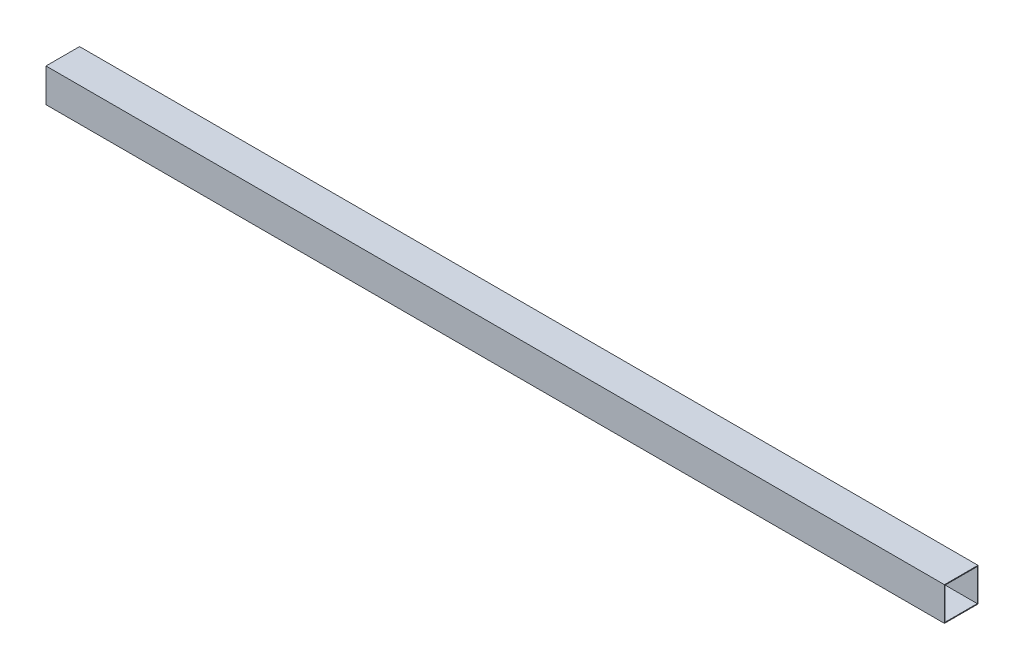
ISO-10303-21;
HEADER;
FILE_DESCRIPTION(('STEP AP214'),'2;1');
FILE_NAME('part.step','',(''),(''),'','','');
FILE_SCHEMA(('AUTOMOTIVE_DESIGN { 1 0 10303 214 1 1 1 1 }'));
ENDSEC;
DATA;
#1=APPLICATION_CONTEXT('core data for automotive mechanical design processes');
#2=APPLICATION_PROTOCOL_DEFINITION('international standard','automotive_design',2000,#1);
#3=PRODUCT_CONTEXT('',#1,'mechanical');
#4=PRODUCT('Part','Part','',(#3));
#5=PRODUCT_RELATED_PRODUCT_CATEGORY('part','',(#4));
#6=PRODUCT_DEFINITION_FORMATION('','',#4);
#7=PRODUCT_DEFINITION_CONTEXT('part definition',#1,'design');
#8=PRODUCT_DEFINITION('design','',#6,#7);
#9=PRODUCT_DEFINITION_SHAPE('','',#8);
#10=(LENGTH_UNIT() NAMED_UNIT(*) SI_UNIT(.MILLI.,.METRE.));
#11=(NAMED_UNIT(*) PLANE_ANGLE_UNIT() SI_UNIT($,.RADIAN.));
#12=(NAMED_UNIT(*) SI_UNIT($,.STERADIAN.) SOLID_ANGLE_UNIT());
#13=UNCERTAINTY_MEASURE_WITH_UNIT(LENGTH_MEASURE(1.E-05),#10,'distance_accuracy_value','');
#14=(GEOMETRIC_REPRESENTATION_CONTEXT(3) GLOBAL_UNCERTAINTY_ASSIGNED_CONTEXT((#13)) GLOBAL_UNIT_ASSIGNED_CONTEXT((#10,
#11,#12)) REPRESENTATION_CONTEXT('',''));
#15=CARTESIAN_POINT('',(0.,0.,0.));
#16=DIRECTION('',(0.,0.,1.));
#17=DIRECTION('',(1.,0.,0.));
#18=AXIS2_PLACEMENT_3D('',#15,#16,#17);
#19=CARTESIAN_POINT('',(0.,-12.7,12.7));
#20=DIRECTION('',(0.,1.,0.));
#21=DIRECTION('',(0.,0.,1.));
#22=AXIS2_PLACEMENT_3D('',#19,#20,#21);
#23=PLANE('',#22);
#24=DIRECTION('',(0.,0.,1.));
#25=VECTOR('',#24,1.);
#26=CARTESIAN_POINT('',(680.,-12.7,12.7));
#27=LINE('',#26,#25);
#28=CARTESIAN_POINT('',(680.,-12.7,-12.7));
#29=VERTEX_POINT('',#28);
#30=CARTESIAN_POINT('',(680.,-12.7,12.7));
#31=VERTEX_POINT('',#30);
#32=EDGE_CURVE('E158',#29,#31,#27,.T.);
#33=ORIENTED_EDGE('',*,*,#32,.T.);
#34=DIRECTION('',(1.,0.,0.));
#35=VECTOR('',#34,1.);
#36=CARTESIAN_POINT('',(0.,-12.7,12.7));
#37=LINE('',#36,#35);
#38=CARTESIAN_POINT('',(0.,-12.7,12.7));
#39=VERTEX_POINT('',#38);
#40=EDGE_CURVE('E12',#39,#31,#37,.T.);
#41=ORIENTED_EDGE('',*,*,#40,.F.);
#42=DIRECTION('',(0.,0.,1.));
#43=VECTOR('',#42,1.);
#44=CARTESIAN_POINT('',(0.,-12.7,12.7));
#45=LINE('',#44,#43);
#46=CARTESIAN_POINT('',(0.,-12.7,-12.7));
#47=VERTEX_POINT('',#46);
#48=EDGE_CURVE('E132',#47,#39,#45,.T.);
#49=ORIENTED_EDGE('',*,*,#48,.F.);
#50=DIRECTION('',(1.,0.,0.));
#51=VECTOR('',#50,1.);
#52=CARTESIAN_POINT('',(0.,-12.7,-12.7));
#53=LINE('',#52,#51);
#54=EDGE_CURVE('E165',#47,#29,#53,.T.);
#55=ORIENTED_EDGE('',*,*,#54,.T.);
#56=EDGE_LOOP('',(#33,#41,#49,#55));
#57=FACE_BOUND('',#56,.T.);
#58=ADVANCED_FACE('F51',(#57),#23,.F.);
#59=CARTESIAN_POINT('',(0.,-12.7,12.7));
#60=DIRECTION('',(0.,0.,-1.));
#61=DIRECTION('',(-1.,0.,0.));
#62=AXIS2_PLACEMENT_3D('',#59,#60,#61);
#63=PLANE('',#62);
#64=DIRECTION('',(0.,1.,0.));
#65=VECTOR('',#64,1.);
#66=CARTESIAN_POINT('',(680.,-12.7,12.7));
#67=LINE('',#66,#65);
#68=CARTESIAN_POINT('',(680.,12.7,12.7));
#69=VERTEX_POINT('',#68);
#70=EDGE_CURVE('E137',#31,#69,#67,.T.);
#71=ORIENTED_EDGE('',*,*,#70,.T.);
#72=DIRECTION('',(1.,0.,0.));
#73=VECTOR('',#72,1.);
#74=CARTESIAN_POINT('',(0.,12.7,12.7));
#75=LINE('',#74,#73);
#76=CARTESIAN_POINT('',(0.,12.7,12.7));
#77=VERTEX_POINT('',#76);
#78=EDGE_CURVE('E61',#77,#69,#75,.T.);
#79=ORIENTED_EDGE('',*,*,#78,.F.);
#80=DIRECTION('',(0.,1.,0.));
#81=VECTOR('',#80,1.);
#82=CARTESIAN_POINT('',(0.,-12.7,12.7));
#83=LINE('',#82,#81);
#84=EDGE_CURVE('E126',#39,#77,#83,.T.);
#85=ORIENTED_EDGE('',*,*,#84,.F.);
#86=ORIENTED_EDGE('',*,*,#40,.T.);
#87=EDGE_LOOP('',(#71,#79,#85,#86));
#88=FACE_BOUND('',#87,.T.);
#89=ADVANCED_FACE('F136',(#88),#63,.F.);
#90=CARTESIAN_POINT('',(0.,12.7,-12.7));
#91=DIRECTION('',(0.,-1.,0.));
#92=DIRECTION('',(0.,0.,-1.));
#93=AXIS2_PLACEMENT_3D('',#90,#91,#92);
#94=PLANE('',#93);
#95=DIRECTION('',(0.,0.,-1.));
#96=VECTOR('',#95,1.);
#97=CARTESIAN_POINT('',(680.,12.7,-12.7));
#98=LINE('',#97,#96);
#99=CARTESIAN_POINT('',(680.,12.7,-12.7));
#100=VERTEX_POINT('',#99);
#101=EDGE_CURVE('E99',#69,#100,#98,.T.);
#102=ORIENTED_EDGE('',*,*,#101,.T.);
#103=DIRECTION('',(1.,0.,0.));
#104=VECTOR('',#103,1.);
#105=CARTESIAN_POINT('',(0.,12.7,-12.7));
#106=LINE('',#105,#104);
#107=CARTESIAN_POINT('',(0.,12.7,-12.7));
#108=VERTEX_POINT('',#107);
#109=EDGE_CURVE('E138',#108,#100,#106,.T.);
#110=ORIENTED_EDGE('',*,*,#109,.F.);
#111=DIRECTION('',(0.,0.,-1.));
#112=VECTOR('',#111,1.);
#113=CARTESIAN_POINT('',(0.,12.7,-12.7));
#114=LINE('',#113,#112);
#115=EDGE_CURVE('E130',#77,#108,#114,.T.);
#116=ORIENTED_EDGE('',*,*,#115,.F.);
#117=ORIENTED_EDGE('',*,*,#78,.T.);
#118=EDGE_LOOP('',(#102,#110,#116,#117));
#119=FACE_BOUND('',#118,.T.);
#120=ADVANCED_FACE('F140',(#119),#94,.F.);
#121=CARTESIAN_POINT('',(0.,-12.1412,12.1412));
#122=DIRECTION('',(0.,0.,-1.));
#123=DIRECTION('',(-1.,0.,0.));
#124=AXIS2_PLACEMENT_3D('',#121,#122,#123);
#125=PLANE('',#124);
#126=DIRECTION('',(0.,1.,0.));
#127=VECTOR('',#126,1.);
#128=CARTESIAN_POINT('',(680.,-12.1412,12.1412));
#129=LINE('',#128,#127);
#130=CARTESIAN_POINT('',(680.,-12.1412,12.1412));
#131=VERTEX_POINT('',#130);
#132=CARTESIAN_POINT('',(680.,12.1412,12.1412));
#133=VERTEX_POINT('',#132);
#134=EDGE_CURVE('E146',#131,#133,#129,.T.);
#135=ORIENTED_EDGE('',*,*,#134,.F.);
#136=DIRECTION('',(1.,0.,0.));
#137=VECTOR('',#136,1.);
#138=CARTESIAN_POINT('',(0.,-12.1412,12.1412));
#139=LINE('',#138,#137);
#140=CARTESIAN_POINT('',(0.,-12.1412,12.1412));
#141=VERTEX_POINT('',#140);
#142=EDGE_CURVE('E55',#141,#131,#139,.T.);
#143=ORIENTED_EDGE('',*,*,#142,.F.);
#144=DIRECTION('',(0.,1.,0.));
#145=VECTOR('',#144,1.);
#146=CARTESIAN_POINT('',(0.,-12.1412,12.1412));
#147=LINE('',#146,#145);
#148=CARTESIAN_POINT('',(0.,12.1412,12.1412));
#149=VERTEX_POINT('',#148);
#150=EDGE_CURVE('E164',#141,#149,#147,.T.);
#151=ORIENTED_EDGE('',*,*,#150,.T.);
#152=DIRECTION('',(1.,0.,0.));
#153=VECTOR('',#152,1.);
#154=CARTESIAN_POINT('',(0.,12.1412,12.1412));
#155=LINE('',#154,#153);
#156=EDGE_CURVE('E142',#149,#133,#155,.T.);
#157=ORIENTED_EDGE('',*,*,#156,.T.);
#158=EDGE_LOOP('',(#135,#143,#151,#157));
#159=FACE_BOUND('',#158,.T.);
#160=ADVANCED_FACE('F53',(#159),#125,.T.);
#161=CARTESIAN_POINT('',(0.,-12.1412,12.1412));
#162=DIRECTION('',(0.,1.,0.));
#163=DIRECTION('',(0.,0.,1.));
#164=AXIS2_PLACEMENT_3D('',#161,#162,#163);
#165=PLANE('',#164);
#166=DIRECTION('',(0.,0.,1.));
#167=VECTOR('',#166,1.);
#168=CARTESIAN_POINT('',(680.,-12.1412,12.1412));
#169=LINE('',#168,#167);
#170=CARTESIAN_POINT('',(680.,-12.1412,-12.1412));
#171=VERTEX_POINT('',#170);
#172=EDGE_CURVE('E149',#171,#131,#169,.T.);
#173=ORIENTED_EDGE('',*,*,#172,.F.);
#174=DIRECTION('',(1.,0.,0.));
#175=VECTOR('',#174,1.);
#176=CARTESIAN_POINT('',(0.,-12.1412,-12.1412));
#177=LINE('',#176,#175);
#178=CARTESIAN_POINT('',(0.,-12.1412,-12.1412));
#179=VERTEX_POINT('',#178);
#180=EDGE_CURVE('E170',#179,#171,#177,.T.);
#181=ORIENTED_EDGE('',*,*,#180,.F.);
#182=DIRECTION('',(0.,0.,1.));
#183=VECTOR('',#182,1.);
#184=CARTESIAN_POINT('',(0.,-12.1412,12.1412));
#185=LINE('',#184,#183);
#186=EDGE_CURVE('E179',#179,#141,#185,.T.);
#187=ORIENTED_EDGE('',*,*,#186,.T.);
#188=ORIENTED_EDGE('',*,*,#142,.T.);
#189=EDGE_LOOP('',(#173,#181,#187,#188));
#190=FACE_BOUND('',#189,.T.);
#191=ADVANCED_FACE('F177',(#190),#165,.T.);
#192=CARTESIAN_POINT('',(0.,12.1412,-12.1412));
#193=DIRECTION('',(0.,0.,1.));
#194=DIRECTION('',(1.,0.,0.));
#195=AXIS2_PLACEMENT_3D('',#192,#193,#194);
#196=PLANE('',#195);
#197=DIRECTION('',(0.,-1.,0.));
#198=VECTOR('',#197,1.);
#199=CARTESIAN_POINT('',(680.,12.1412,-12.1412));
#200=LINE('',#199,#198);
#201=CARTESIAN_POINT('',(680.,12.1412,-12.1412));
#202=VERTEX_POINT('',#201);
#203=EDGE_CURVE('E152',#202,#171,#200,.T.);
#204=ORIENTED_EDGE('',*,*,#203,.F.);
#205=DIRECTION('',(1.,0.,0.));
#206=VECTOR('',#205,1.);
#207=CARTESIAN_POINT('',(0.,12.1412,-12.1412));
#208=LINE('',#207,#206);
#209=CARTESIAN_POINT('',(0.,12.1412,-12.1412));
#210=VERTEX_POINT('',#209);
#211=EDGE_CURVE('E169',#210,#202,#208,.T.);
#212=ORIENTED_EDGE('',*,*,#211,.F.);
#213=DIRECTION('',(0.,-1.,0.));
#214=VECTOR('',#213,1.);
#215=CARTESIAN_POINT('',(0.,12.1412,-12.1412));
#216=LINE('',#215,#214);
#217=EDGE_CURVE('E186',#210,#179,#216,.T.);
#218=ORIENTED_EDGE('',*,*,#217,.T.);
#219=ORIENTED_EDGE('',*,*,#180,.T.);
#220=EDGE_LOOP('',(#204,#212,#218,#219));
#221=FACE_BOUND('',#220,.T.);
#222=ADVANCED_FACE('F184',(#221),#196,.T.);
#223=CARTESIAN_POINT('',(0.,12.1412,-12.1412));
#224=DIRECTION('',(0.,-1.,0.));
#225=DIRECTION('',(0.,0.,-1.));
#226=AXIS2_PLACEMENT_3D('',#223,#224,#225);
#227=PLANE('',#226);
#228=DIRECTION('',(0.,0.,-1.));
#229=VECTOR('',#228,1.);
#230=CARTESIAN_POINT('',(680.,12.1412,-12.1412));
#231=LINE('',#230,#229);
#232=EDGE_CURVE('E155',#133,#202,#231,.T.);
#233=ORIENTED_EDGE('',*,*,#232,.F.);
#234=ORIENTED_EDGE('',*,*,#156,.F.);
#235=DIRECTION('',(0.,0.,-1.));
#236=VECTOR('',#235,1.);
#237=CARTESIAN_POINT('',(0.,12.1412,-12.1412));
#238=LINE('',#237,#236);
#239=EDGE_CURVE('E191',#149,#210,#238,.T.);
#240=ORIENTED_EDGE('',*,*,#239,.T.);
#241=ORIENTED_EDGE('',*,*,#211,.T.);
#242=EDGE_LOOP('',(#233,#234,#240,#241));
#243=FACE_BOUND('',#242,.T.);
#244=ADVANCED_FACE('F193',(#243),#227,.T.);
#245=CARTESIAN_POINT('',(0.,12.7,-12.7));
#246=DIRECTION('',(0.,0.,1.));
#247=DIRECTION('',(0.,-1.,0.));
#248=AXIS2_PLACEMENT_3D('',#245,#246,#247);
#249=PLANE('',#248);
#250=DIRECTION('',(0.,-1.,0.));
#251=VECTOR('',#250,1.);
#252=CARTESIAN_POINT('',(680.,12.7,-12.7));
#253=LINE('',#252,#251);
#254=EDGE_CURVE('E105',#100,#29,#253,.T.);
#255=ORIENTED_EDGE('',*,*,#254,.T.);
#256=ORIENTED_EDGE('',*,*,#54,.F.);
#257=DIRECTION('',(0.,-1.,0.));
#258=VECTOR('',#257,1.);
#259=CARTESIAN_POINT('',(0.,12.7,-12.7));
#260=LINE('',#259,#258);
#261=EDGE_CURVE('E70',#108,#47,#260,.T.);
#262=ORIENTED_EDGE('',*,*,#261,.F.);
#263=ORIENTED_EDGE('',*,*,#109,.T.);
#264=EDGE_LOOP('',(#255,#256,#262,#263));
#265=FACE_BOUND('',#264,.T.);
#266=ADVANCED_FACE('F198',(#265),#249,.F.);
#267=CARTESIAN_POINT('',(0.,0.,0.));
#268=DIRECTION('',(-1.,0.,0.));
#269=DIRECTION('',(0.,0.,1.));
#270=AXIS2_PLACEMENT_3D('',#267,#268,#269);
#271=PLANE('',#270);
#272=ORIENTED_EDGE('',*,*,#150,.F.);
#273=ORIENTED_EDGE('',*,*,#186,.F.);
#274=ORIENTED_EDGE('',*,*,#217,.F.);
#275=ORIENTED_EDGE('',*,*,#239,.F.);
#276=EDGE_LOOP('',(#272,#273,#274,#275));
#277=FACE_BOUND('',#276,.T.);
#278=ORIENTED_EDGE('',*,*,#48,.T.);
#279=ORIENTED_EDGE('',*,*,#84,.T.);
#280=ORIENTED_EDGE('',*,*,#115,.T.);
#281=ORIENTED_EDGE('',*,*,#261,.T.);
#282=EDGE_LOOP('',(#278,#279,#280,#281));
#283=FACE_BOUND('',#282,.T.);
#284=ADVANCED_FACE('F128',(#277,#283),#271,.T.);
#285=CARTESIAN_POINT('',(680.,0.,0.));
#286=DIRECTION('',(-1.,0.,0.));
#287=DIRECTION('',(0.,0.,1.));
#288=AXIS2_PLACEMENT_3D('',#285,#286,#287);
#289=PLANE('',#288);
#290=ORIENTED_EDGE('',*,*,#134,.T.);
#291=ORIENTED_EDGE('',*,*,#232,.T.);
#292=ORIENTED_EDGE('',*,*,#203,.T.);
#293=ORIENTED_EDGE('',*,*,#172,.T.);
#294=EDGE_LOOP('',(#290,#291,#292,#293));
#295=FACE_BOUND('',#294,.T.);
#296=ORIENTED_EDGE('',*,*,#32,.F.);
#297=ORIENTED_EDGE('',*,*,#254,.F.);
#298=ORIENTED_EDGE('',*,*,#101,.F.);
#299=ORIENTED_EDGE('',*,*,#70,.F.);
#300=EDGE_LOOP('',(#296,#297,#298,#299));
#301=FACE_BOUND('',#300,.T.);
#302=ADVANCED_FACE('F182',(#295,#301),#289,.F.);
#303=CLOSED_SHELL('',(#58,#89,#120,#160,#191,#222,#244,#266,#284,#302));
#304=MANIFOLD_SOLID_BREP('B2',#303);
#305=ADVANCED_BREP_SHAPE_REPRESENTATION('',(#18,#304),#14);
#306=SHAPE_DEFINITION_REPRESENTATION(#9,#305);
ENDSEC;
END-ISO-10303-21;
